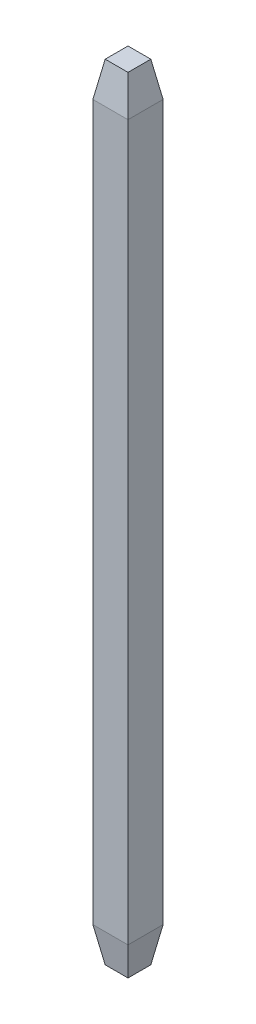
ISO-10303-21;
HEADER;
FILE_DESCRIPTION(('STEP AP214'),'2;1');
FILE_NAME('part.step','',(''),(''),'','','');
FILE_SCHEMA(('AUTOMOTIVE_DESIGN { 1 0 10303 214 1 1 1 1 }'));
ENDSEC;
DATA;
#1=APPLICATION_CONTEXT('core data for automotive mechanical design processes');
#2=APPLICATION_PROTOCOL_DEFINITION('international standard','automotive_design',2000,#1);
#3=PRODUCT_CONTEXT('',#1,'mechanical');
#4=PRODUCT('Part','Part','',(#3));
#5=PRODUCT_RELATED_PRODUCT_CATEGORY('part','',(#4));
#6=PRODUCT_DEFINITION_FORMATION('','',#4);
#7=PRODUCT_DEFINITION_CONTEXT('part definition',#1,'design');
#8=PRODUCT_DEFINITION('design','',#6,#7);
#9=PRODUCT_DEFINITION_SHAPE('','',#8);
#10=(LENGTH_UNIT() NAMED_UNIT(*) SI_UNIT(.MILLI.,.METRE.));
#11=(NAMED_UNIT(*) PLANE_ANGLE_UNIT() SI_UNIT($,.RADIAN.));
#12=(NAMED_UNIT(*) SI_UNIT($,.STERADIAN.) SOLID_ANGLE_UNIT());
#13=UNCERTAINTY_MEASURE_WITH_UNIT(LENGTH_MEASURE(1.E-05),#10,'distance_accuracy_value','');
#14=(GEOMETRIC_REPRESENTATION_CONTEXT(3) GLOBAL_UNCERTAINTY_ASSIGNED_CONTEXT((#13)) GLOBAL_UNIT_ASSIGNED_CONTEXT((#10,
#11,#12)) REPRESENTATION_CONTEXT('',''));
#15=CARTESIAN_POINT('',(0.,0.,0.));
#16=DIRECTION('',(0.,0.,1.));
#17=DIRECTION('',(1.,0.,0.));
#18=AXIS2_PLACEMENT_3D('',#15,#16,#17);
#19=CARTESIAN_POINT('',(-9.271,-14.1184204896855,1.016));
#20=DIRECTION('',(-1.,0.,0.));
#21=DIRECTION('',(0.,0.,1.));
#22=AXIS2_PLACEMENT_3D('',#19,#20,#21);
#23=PLANE('',#22);
#24=DIRECTION('',(0.,1.,0.));
#25=VECTOR('',#24,1.);
#26=CARTESIAN_POINT('',(-9.271,-14.1184204896855,1.524));
#27=LINE('',#26,#25);
#28=CARTESIAN_POINT('',(-9.271,-4.99582304623598,1.524));
#29=VERTEX_POINT('',#28);
#30=CARTESIAN_POINT('',(-9.271,5.34582304623598,1.524));
#31=VERTEX_POINT('',#30);
#32=EDGE_CURVE('E11',#29,#31,#27,.T.);
#33=ORIENTED_EDGE('',*,*,#32,.T.);
#34=DIRECTION('',(0.,0.,-1.));
#35=VECTOR('',#34,1.);
#36=CARTESIAN_POINT('',(-9.271,5.34582304623598,1.016));
#37=LINE('',#36,#35);
#38=CARTESIAN_POINT('',(-9.271,5.34582304623598,1.016));
#39=VERTEX_POINT('',#38);
#40=EDGE_CURVE('E24',#31,#39,#37,.T.);
#41=ORIENTED_EDGE('',*,*,#40,.T.);
#42=DIRECTION('',(0.,1.,0.));
#43=VECTOR('',#42,1.);
#44=CARTESIAN_POINT('',(-9.271,-14.1184204896855,1.016));
#45=LINE('',#44,#43);
#46=CARTESIAN_POINT('',(-9.271,-4.99582304623598,1.016));
#47=VERTEX_POINT('',#46);
#48=EDGE_CURVE('E138',#47,#39,#45,.T.);
#49=ORIENTED_EDGE('',*,*,#48,.F.);
#50=DIRECTION('',(0.,0.,1.));
#51=VECTOR('',#50,1.);
#52=CARTESIAN_POINT('',(-9.271,-4.99582304623598,1.524));
#53=LINE('',#52,#51);
#54=EDGE_CURVE('E136',#47,#29,#53,.T.);
#55=ORIENTED_EDGE('',*,*,#54,.T.);
#56=EDGE_LOOP('',(#33,#41,#49,#55));
#57=FACE_BOUND('',#56,.T.);
#58=ADVANCED_FACE('F17',(#57),#23,.T.);
#59=CARTESIAN_POINT('',(-9.271,-14.1184204896855,1.016));
#60=DIRECTION('',(0.,0.,-1.));
#61=DIRECTION('',(-1.,0.,0.));
#62=AXIS2_PLACEMENT_3D('',#59,#60,#61);
#63=PLANE('',#62);
#64=ORIENTED_EDGE('',*,*,#48,.T.);
#65=DIRECTION('',(1.,0.,0.));
#66=VECTOR('',#65,1.);
#67=CARTESIAN_POINT('',(-9.271,5.34582304623598,1.016));
#68=LINE('',#67,#66);
#69=CARTESIAN_POINT('',(-8.763,5.34582304623598,1.016));
#70=VERTEX_POINT('',#69);
#71=EDGE_CURVE('E99',#39,#70,#68,.T.);
#72=ORIENTED_EDGE('',*,*,#71,.T.);
#73=DIRECTION('',(0.,1.,0.));
#74=VECTOR('',#73,1.);
#75=CARTESIAN_POINT('',(-8.763,-14.1184204896855,1.016));
#76=LINE('',#75,#74);
#77=CARTESIAN_POINT('',(-8.763,-4.99582304623598,1.016));
#78=VERTEX_POINT('',#77);
#79=EDGE_CURVE('E132',#78,#70,#76,.T.);
#80=ORIENTED_EDGE('',*,*,#79,.F.);
#81=DIRECTION('',(-1.,0.,0.));
#82=VECTOR('',#81,1.);
#83=CARTESIAN_POINT('',(-9.271,-4.99582304623598,1.016));
#84=LINE('',#83,#82);
#85=EDGE_CURVE('E129',#78,#47,#84,.T.);
#86=ORIENTED_EDGE('',*,*,#85,.T.);
#87=EDGE_LOOP('',(#64,#72,#80,#86));
#88=FACE_BOUND('',#87,.T.);
#89=ADVANCED_FACE('F142',(#88),#63,.T.);
#90=CARTESIAN_POINT('',(-8.763,-14.1184204896855,1.016));
#91=DIRECTION('',(1.,0.,0.));
#92=DIRECTION('',(0.,0.,-1.));
#93=AXIS2_PLACEMENT_3D('',#90,#91,#92);
#94=PLANE('',#93);
#95=ORIENTED_EDGE('',*,*,#79,.T.);
#96=DIRECTION('',(0.,0.,1.));
#97=VECTOR('',#96,1.);
#98=CARTESIAN_POINT('',(-8.763,5.34582304623598,1.016));
#99=LINE('',#98,#97);
#100=CARTESIAN_POINT('',(-8.763,5.34582304623598,1.524));
#101=VERTEX_POINT('',#100);
#102=EDGE_CURVE('E127',#70,#101,#99,.T.);
#103=ORIENTED_EDGE('',*,*,#102,.T.);
#104=DIRECTION('',(0.,1.,0.));
#105=VECTOR('',#104,1.);
#106=CARTESIAN_POINT('',(-8.763,-14.1184204896855,1.524));
#107=LINE('',#106,#105);
#108=CARTESIAN_POINT('',(-8.763,-4.99582304623598,1.524));
#109=VERTEX_POINT('',#108);
#110=EDGE_CURVE('E124',#109,#101,#107,.T.);
#111=ORIENTED_EDGE('',*,*,#110,.F.);
#112=DIRECTION('',(0.,0.,-1.));
#113=VECTOR('',#112,1.);
#114=CARTESIAN_POINT('',(-8.763,-4.99582304623598,1.016));
#115=LINE('',#114,#113);
#116=EDGE_CURVE('E121',#109,#78,#115,.T.);
#117=ORIENTED_EDGE('',*,*,#116,.T.);
#118=EDGE_LOOP('',(#95,#103,#111,#117));
#119=FACE_BOUND('',#118,.T.);
#120=ADVANCED_FACE('F174',(#119),#94,.T.);
#121=CARTESIAN_POINT('',(-9.271,-14.1184204896855,1.524));
#122=DIRECTION('',(0.,0.,1.));
#123=DIRECTION('',(1.,0.,0.));
#124=AXIS2_PLACEMENT_3D('',#121,#122,#123);
#125=PLANE('',#124);
#126=ORIENTED_EDGE('',*,*,#110,.T.);
#127=DIRECTION('',(-1.,0.,0.));
#128=VECTOR('',#127,1.);
#129=CARTESIAN_POINT('',(-9.271,5.34582304623598,1.524));
#130=LINE('',#129,#128);
#131=EDGE_CURVE('E119',#101,#31,#130,.T.);
#132=ORIENTED_EDGE('',*,*,#131,.T.);
#133=ORIENTED_EDGE('',*,*,#32,.F.);
#134=DIRECTION('',(1.,0.,0.));
#135=VECTOR('',#134,1.);
#136=CARTESIAN_POINT('',(-8.763,-4.99582304623598,1.524));
#137=LINE('',#136,#135);
#138=EDGE_CURVE('E117',#29,#109,#137,.T.);
#139=ORIENTED_EDGE('',*,*,#138,.T.);
#140=EDGE_LOOP('',(#126,#132,#133,#139));
#141=FACE_BOUND('',#140,.T.);
#142=ADVANCED_FACE('F169',(#141),#125,.T.);
#143=CARTESIAN_POINT('',(0.,-5.5,0.));
#144=DIRECTION('',(0.,1.,0.));
#145=DIRECTION('',(0.,0.,1.));
#146=AXIS2_PLACEMENT_3D('',#143,#144,#145);
#147=PLANE('',#146);
#148=DIRECTION('',(0.,0.,1.));
#149=VECTOR('',#148,1.);
#150=CARTESIAN_POINT('',(-8.8519,-5.5,1.524));
#151=LINE('',#150,#149);
#152=CARTESIAN_POINT('',(-8.8519,-5.5,1.1049));
#153=VERTEX_POINT('',#152);
#154=CARTESIAN_POINT('',(-8.8519,-5.5,1.4351));
#155=VERTEX_POINT('',#154);
#156=EDGE_CURVE('E115',#153,#155,#151,.T.);
#157=ORIENTED_EDGE('',*,*,#156,.T.);
#158=DIRECTION('',(-1.,0.,0.));
#159=VECTOR('',#158,1.);
#160=CARTESIAN_POINT('',(-9.271,-5.5,1.4351));
#161=LINE('',#160,#159);
#162=CARTESIAN_POINT('',(-9.1821,-5.5,1.4351));
#163=VERTEX_POINT('',#162);
#164=EDGE_CURVE('E113',#155,#163,#161,.T.);
#165=ORIENTED_EDGE('',*,*,#164,.T.);
#166=DIRECTION('',(0.,0.,-1.));
#167=VECTOR('',#166,1.);
#168=CARTESIAN_POINT('',(-9.1821,-5.5,1.016));
#169=LINE('',#168,#167);
#170=CARTESIAN_POINT('',(-9.1821,-5.5,1.1049));
#171=VERTEX_POINT('',#170);
#172=EDGE_CURVE('E111',#163,#171,#169,.T.);
#173=ORIENTED_EDGE('',*,*,#172,.T.);
#174=DIRECTION('',(1.,0.,0.));
#175=VECTOR('',#174,1.);
#176=CARTESIAN_POINT('',(-8.763,-5.5,1.1049));
#177=LINE('',#176,#175);
#178=EDGE_CURVE('E108',#171,#153,#177,.T.);
#179=ORIENTED_EDGE('',*,*,#178,.T.);
#180=EDGE_LOOP('',(#157,#165,#173,#179));
#181=FACE_BOUND('',#180,.T.);
#182=ADVANCED_FACE('F180',(#181),#147,.F.);
#183=CARTESIAN_POINT('',(0.,5.85,0.));
#184=DIRECTION('',(0.,1.,0.));
#185=DIRECTION('',(0.,0.,1.));
#186=AXIS2_PLACEMENT_3D('',#183,#184,#185);
#187=PLANE('',#186);
#188=DIRECTION('',(1.,0.,0.));
#189=VECTOR('',#188,1.);
#190=CARTESIAN_POINT('',(0.,5.85,1.4351));
#191=LINE('',#190,#189);
#192=CARTESIAN_POINT('',(-9.1821,5.85,1.4351));
#193=VERTEX_POINT('',#192);
#194=CARTESIAN_POINT('',(-8.8519,5.85,1.4351));
#195=VERTEX_POINT('',#194);
#196=EDGE_CURVE('E106',#193,#195,#191,.T.);
#197=ORIENTED_EDGE('',*,*,#196,.T.);
#198=DIRECTION('',(0.,0.,-1.));
#199=VECTOR('',#198,1.);
#200=CARTESIAN_POINT('',(-8.8519,5.85,0.));
#201=LINE('',#200,#199);
#202=CARTESIAN_POINT('',(-8.8519,5.85,1.1049));
#203=VERTEX_POINT('',#202);
#204=EDGE_CURVE('E84',#195,#203,#201,.T.);
#205=ORIENTED_EDGE('',*,*,#204,.T.);
#206=DIRECTION('',(-1.,0.,0.));
#207=VECTOR('',#206,1.);
#208=CARTESIAN_POINT('',(0.,5.85,1.1049));
#209=LINE('',#208,#207);
#210=CARTESIAN_POINT('',(-9.1821,5.85,1.1049));
#211=VERTEX_POINT('',#210);
#212=EDGE_CURVE('E78',#203,#211,#209,.T.);
#213=ORIENTED_EDGE('',*,*,#212,.T.);
#214=DIRECTION('',(0.,0.,1.));
#215=VECTOR('',#214,1.);
#216=CARTESIAN_POINT('',(-9.1821,5.85,0.));
#217=LINE('',#216,#215);
#218=EDGE_CURVE('E81',#211,#193,#217,.T.);
#219=ORIENTED_EDGE('',*,*,#218,.T.);
#220=EDGE_LOOP('',(#197,#205,#213,#219));
#221=FACE_BOUND('',#220,.T.);
#222=ADVANCED_FACE('F80',(#221),#187,.T.);
#223=CARTESIAN_POINT('',(-9.1821,5.85,0.));
#224=DIRECTION('',(0.984807753012209,-0.173648177666927,0.));
#225=DIRECTION('',(0.,0.,1.));
#226=AXIS2_PLACEMENT_3D('',#223,#224,#225);
#227=PLANE('',#226);
#228=DIRECTION('',(0.171087869746032,0.970287525247815,0.171087869746032));
#229=VECTOR('',#228,1.);
#230=CARTESIAN_POINT('',(-8.91333020755625,7.37426923754867,1.37366979244375));
#231=LINE('',#230,#229);
#232=EDGE_CURVE('E93',#39,#211,#231,.T.);
#233=ORIENTED_EDGE('',*,*,#232,.F.);
#234=ORIENTED_EDGE('',*,*,#40,.F.);
#235=DIRECTION('',(-0.171087869746032,-0.970287525247815,0.171087869746032));
#236=VECTOR('',#235,1.);
#237=CARTESIAN_POINT('',(-9.14009310297906,6.08823295137344,1.39309310297906));
#238=LINE('',#237,#236);
#239=EDGE_CURVE('E95',#193,#31,#238,.T.);
#240=ORIENTED_EDGE('',*,*,#239,.F.);
#241=ORIENTED_EDGE('',*,*,#218,.F.);
#242=EDGE_LOOP('',(#233,#234,#240,#241));
#243=FACE_BOUND('',#242,.T.);
#244=ADVANCED_FACE('F92',(#243),#227,.F.);
#245=CARTESIAN_POINT('',(0.,5.85,1.4351));
#246=DIRECTION('',(0.,-0.173648177666927,-0.984807753012209));
#247=DIRECTION('',(1.,0.,0.));
#248=AXIS2_PLACEMENT_3D('',#245,#246,#247);
#249=PLANE('',#248);
#250=ORIENTED_EDGE('',*,*,#239,.T.);
#251=ORIENTED_EDGE('',*,*,#131,.F.);
#252=DIRECTION('',(0.171087869746032,-0.970287525247815,0.171087869746032));
#253=VECTOR('',#252,1.);
#254=CARTESIAN_POINT('',(-8.59279551129559,4.38054542382929,1.69420448870442));
#255=LINE('',#254,#253);
#256=EDGE_CURVE('E101',#195,#101,#255,.T.);
#257=ORIENTED_EDGE('',*,*,#256,.F.);
#258=ORIENTED_EDGE('',*,*,#196,.F.);
#259=EDGE_LOOP('',(#250,#251,#257,#258));
#260=FACE_BOUND('',#259,.T.);
#261=ADVANCED_FACE('F168',(#260),#249,.F.);
#262=CARTESIAN_POINT('',(0.,5.85,1.1049));
#263=DIRECTION('',(0.,-0.173648177666927,0.984807753012209));
#264=DIRECTION('',(-1.,0.,0.));
#265=AXIS2_PLACEMENT_3D('',#262,#263,#264);
#266=PLANE('',#265);
#267=ORIENTED_EDGE('',*,*,#232,.T.);
#268=ORIENTED_EDGE('',*,*,#212,.F.);
#269=DIRECTION('',(-0.171087869746032,0.970287525247815,0.171087869746032));
#270=VECTOR('',#269,1.);
#271=CARTESIAN_POINT('',(-8.59279551129559,4.38054542382929,0.845795511295589));
#272=LINE('',#271,#270);
#273=EDGE_CURVE('E153',#70,#203,#272,.T.);
#274=ORIENTED_EDGE('',*,*,#273,.F.);
#275=ORIENTED_EDGE('',*,*,#71,.F.);
#276=EDGE_LOOP('',(#267,#268,#274,#275));
#277=FACE_BOUND('',#276,.T.);
#278=ADVANCED_FACE('F98',(#277),#266,.F.);
#279=CARTESIAN_POINT('',(-8.8519,5.85,0.));
#280=DIRECTION('',(-0.984807753012209,-0.173648177666927,0.));
#281=DIRECTION('',(0.,0.,-1.));
#282=AXIS2_PLACEMENT_3D('',#279,#280,#281);
#283=PLANE('',#282);
#284=ORIENTED_EDGE('',*,*,#256,.T.);
#285=ORIENTED_EDGE('',*,*,#102,.F.);
#286=ORIENTED_EDGE('',*,*,#273,.T.);
#287=ORIENTED_EDGE('',*,*,#204,.F.);
#288=EDGE_LOOP('',(#284,#285,#286,#287));
#289=FACE_BOUND('',#288,.T.);
#290=ADVANCED_FACE('F165',(#289),#283,.F.);
#291=CARTESIAN_POINT('',(0.,-5.5,1.1049));
#292=DIRECTION('',(0.,-0.173648177666927,-0.984807753012209));
#293=DIRECTION('',(-1.,0.,0.));
#294=AXIS2_PLACEMENT_3D('',#291,#292,#293);
#295=PLANE('',#294);
#296=DIRECTION('',(0.171087869746032,-0.970287525247815,0.171087869746032));
#297=VECTOR('',#296,1.);
#298=CARTESIAN_POINT('',(-9.21444159328161,-5.31658171000452,1.07255840671839));
#299=LINE('',#298,#297);
#300=EDGE_CURVE('E149',#47,#171,#299,.T.);
#301=ORIENTED_EDGE('',*,*,#300,.F.);
#302=ORIENTED_EDGE('',*,*,#85,.F.);
#303=DIRECTION('',(0.171087869746032,0.970287525247815,-0.171087869746032));
#304=VECTOR('',#303,1.);
#305=CARTESIAN_POINT('',(-8.59279551129559,-4.03054542382929,0.845795511295589));
#306=LINE('',#305,#304);
#307=EDGE_CURVE('E154',#153,#78,#306,.T.);
#308=ORIENTED_EDGE('',*,*,#307,.F.);
#309=ORIENTED_EDGE('',*,*,#178,.F.);
#310=EDGE_LOOP('',(#301,#302,#308,#309));
#311=FACE_BOUND('',#310,.T.);
#312=ADVANCED_FACE('F150',(#311),#295,.T.);
#313=CARTESIAN_POINT('',(-8.8519,-5.5,0.));
#314=DIRECTION('',(0.984807753012209,-0.173648177666927,0.));
#315=DIRECTION('',(0.,0.,-1.));
#316=AXIS2_PLACEMENT_3D('',#313,#314,#315);
#317=PLANE('',#316);
#318=ORIENTED_EDGE('',*,*,#307,.T.);
#319=ORIENTED_EDGE('',*,*,#116,.F.);
#320=DIRECTION('',(0.171087869746032,0.970287525247815,0.171087869746032));
#321=VECTOR('',#320,1.);
#322=CARTESIAN_POINT('',(-8.89390689702094,-5.73823295137344,1.39309310297906));
#323=LINE('',#322,#321);
#324=EDGE_CURVE('E158',#155,#109,#323,.T.);
#325=ORIENTED_EDGE('',*,*,#324,.F.);
#326=ORIENTED_EDGE('',*,*,#156,.F.);
#327=EDGE_LOOP('',(#318,#319,#325,#326));
#328=FACE_BOUND('',#327,.T.);
#329=ADVANCED_FACE('F177',(#328),#317,.T.);
#330=CARTESIAN_POINT('',(-9.1821,-5.5,0.));
#331=DIRECTION('',(-0.984807753012209,-0.173648177666927,0.));
#332=DIRECTION('',(0.,0.,1.));
#333=AXIS2_PLACEMENT_3D('',#330,#331,#332);
#334=PLANE('',#333);
#335=ORIENTED_EDGE('',*,*,#300,.T.);
#336=ORIENTED_EDGE('',*,*,#172,.F.);
#337=DIRECTION('',(0.171087869746032,-0.970287525247815,-0.171087869746032));
#338=VECTOR('',#337,1.);
#339=CARTESIAN_POINT('',(-9.14009310297906,-5.73823295137344,1.39309310297906));
#340=LINE('',#339,#338);
#341=EDGE_CURVE('E184',#29,#163,#340,.T.);
#342=ORIENTED_EDGE('',*,*,#341,.F.);
#343=ORIENTED_EDGE('',*,*,#54,.F.);
#344=EDGE_LOOP('',(#335,#336,#342,#343));
#345=FACE_BOUND('',#344,.T.);
#346=ADVANCED_FACE('F183',(#345),#334,.T.);
#347=CARTESIAN_POINT('',(0.,-5.5,1.4351));
#348=DIRECTION('',(0.,-0.173648177666927,0.984807753012209));
#349=DIRECTION('',(1.,0.,0.));
#350=AXIS2_PLACEMENT_3D('',#347,#348,#349);
#351=PLANE('',#350);
#352=ORIENTED_EDGE('',*,*,#324,.T.);
#353=ORIENTED_EDGE('',*,*,#138,.F.);
#354=ORIENTED_EDGE('',*,*,#341,.T.);
#355=ORIENTED_EDGE('',*,*,#164,.F.);
#356=EDGE_LOOP('',(#352,#353,#354,#355));
#357=FACE_BOUND('',#356,.T.);
#358=ADVANCED_FACE('F186',(#357),#351,.T.);
#359=CLOSED_SHELL('',(#58,#89,#120,#142,#182,#222,#244,#261,#278,#290,#312,#329,#346,#358));
#360=MANIFOLD_SOLID_BREP('B1',#359);
#361=ADVANCED_BREP_SHAPE_REPRESENTATION('',(#18,#360),#14);
#362=SHAPE_DEFINITION_REPRESENTATION(#9,#361);
ENDSEC;
END-ISO-10303-21;
